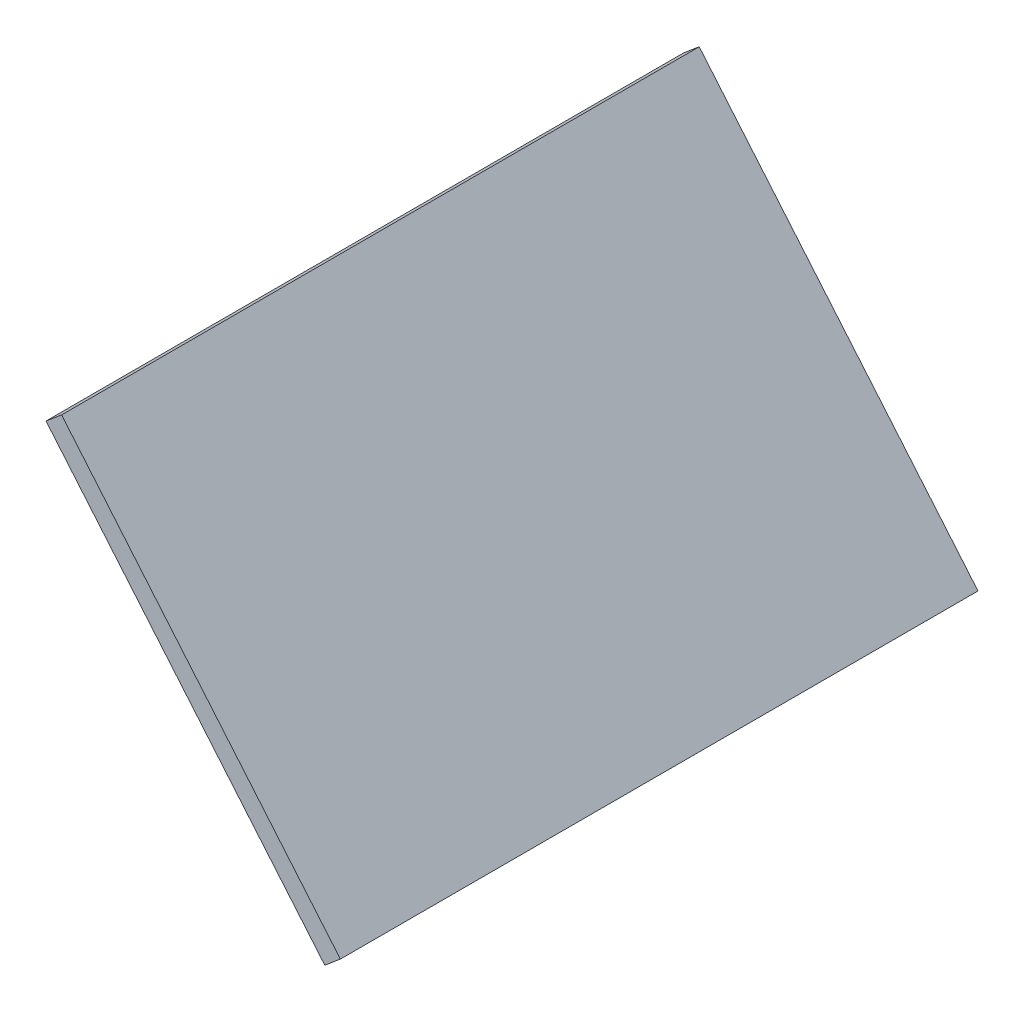
ISO-10303-21;
HEADER;
FILE_DESCRIPTION(('STEP AP214'),'2;1');
FILE_NAME('part.step','',(''),(''),'','','');
FILE_SCHEMA(('AUTOMOTIVE_DESIGN { 1 0 10303 214 1 1 1 1 }'));
ENDSEC;
DATA;
#1=APPLICATION_CONTEXT('core data for automotive mechanical design processes');
#2=APPLICATION_PROTOCOL_DEFINITION('international standard','automotive_design',2000,#1);
#3=PRODUCT_CONTEXT('',#1,'mechanical');
#4=PRODUCT('Part','Part','',(#3));
#5=PRODUCT_RELATED_PRODUCT_CATEGORY('part','',(#4));
#6=PRODUCT_DEFINITION_FORMATION('','',#4);
#7=PRODUCT_DEFINITION_CONTEXT('part definition',#1,'design');
#8=PRODUCT_DEFINITION('design','',#6,#7);
#9=PRODUCT_DEFINITION_SHAPE('','',#8);
#10=(LENGTH_UNIT() NAMED_UNIT(*) SI_UNIT(.MILLI.,.METRE.));
#11=(NAMED_UNIT(*) PLANE_ANGLE_UNIT() SI_UNIT($,.RADIAN.));
#12=(NAMED_UNIT(*) SI_UNIT($,.STERADIAN.) SOLID_ANGLE_UNIT());
#13=UNCERTAINTY_MEASURE_WITH_UNIT(LENGTH_MEASURE(1.E-05),#10,'distance_accuracy_value','');
#14=(GEOMETRIC_REPRESENTATION_CONTEXT(3) GLOBAL_UNCERTAINTY_ASSIGNED_CONTEXT((#13)) GLOBAL_UNIT_ASSIGNED_CONTEXT((#10,
#11,#12)) REPRESENTATION_CONTEXT('',''));
#15=CARTESIAN_POINT('',(0.,0.,0.));
#16=DIRECTION('',(0.,0.,1.));
#17=DIRECTION('',(1.,0.,0.));
#18=AXIS2_PLACEMENT_3D('',#15,#16,#17);
#19=CARTESIAN_POINT('',(-19.177,38.1,38.1));
#20=DIRECTION('',(0.765704864789611,0.643192086423273,0.));
#21=DIRECTION('',(-0.643192086423273,0.765704864789611,0.));
#22=AXIS2_PLACEMENT_3D('',#19,#20,#21);
#23=PLANE('',#22);
#24=DIRECTION('',(0.643192086423273,-0.765704864789611,0.));
#25=VECTOR('',#24,1.);
#26=CARTESIAN_POINT('',(-19.177,38.1,-38.1));
#27=LINE('',#26,#25);
#28=CARTESIAN_POINT('',(-19.177,38.1,-38.1));
#29=VERTEX_POINT('',#28);
#30=CARTESIAN_POINT('',(14.1404849906192,-1.56367260787992,-38.1));
#31=VERTEX_POINT('',#30);
#32=EDGE_CURVE('E67',#29,#31,#27,.T.);
#33=ORIENTED_EDGE('',*,*,#32,.T.);
#34=DIRECTION('',(0.,0.,1.));
#35=VECTOR('',#34,1.);
#36=CARTESIAN_POINT('',(14.1404849906192,-1.56367260787992,-41.6391661482098));
#37=LINE('',#36,#35);
#38=CARTESIAN_POINT('',(14.1404849906192,-1.56367260787992,38.1));
#39=VERTEX_POINT('',#38);
#40=EDGE_CURVE('E123',#31,#39,#37,.T.);
#41=ORIENTED_EDGE('',*,*,#40,.T.);
#42=DIRECTION('',(0.643192086423273,-0.765704864789611,0.));
#43=VECTOR('',#42,1.);
#44=CARTESIAN_POINT('',(-19.177,38.1,38.1));
#45=LINE('',#44,#43);
#46=CARTESIAN_POINT('',(-19.177,38.1,38.1));
#47=VERTEX_POINT('',#46);
#48=EDGE_CURVE('E87',#47,#39,#45,.T.);
#49=ORIENTED_EDGE('',*,*,#48,.F.);
#50=DIRECTION('',(0.,0.,-1.));
#51=VECTOR('',#50,1.);
#52=CARTESIAN_POINT('',(-19.177,38.1,38.1));
#53=LINE('',#52,#51);
#54=EDGE_CURVE('E12',#47,#29,#53,.T.);
#55=ORIENTED_EDGE('',*,*,#54,.T.);
#56=EDGE_LOOP('',(#33,#41,#49,#55));
#57=FACE_BOUND('',#56,.T.);
#58=ADVANCED_FACE('F40',(#57),#23,.F.);
#59=CARTESIAN_POINT('',(-16.002,38.1,38.1));
#60=DIRECTION('',(-0.765704864789611,-0.643192086423273,0.));
#61=DIRECTION('',(0.643192086423273,-0.765704864789611,0.));
#62=AXIS2_PLACEMENT_3D('',#59,#60,#61);
#63=PLANE('',#62);
#64=DIRECTION('',(-0.643192086423273,0.765704864789611,0.));
#65=VECTOR('',#64,1.);
#66=CARTESIAN_POINT('',(-16.002,38.1,-38.1));
#67=LINE('',#66,#65);
#68=CARTESIAN_POINT('',(16.002,0.,-38.1));
#69=VERTEX_POINT('',#68);
#70=CARTESIAN_POINT('',(-17.3154849906191,39.6636726078799,-38.1));
#71=VERTEX_POINT('',#70);
#72=EDGE_CURVE('E93',#69,#71,#67,.T.);
#73=ORIENTED_EDGE('',*,*,#72,.T.);
#74=DIRECTION('',(0.,0.,1.));
#75=VECTOR('',#74,1.);
#76=CARTESIAN_POINT('',(-17.3154849906191,39.6636726078799,-41.6391661482098));
#77=LINE('',#76,#75);
#78=CARTESIAN_POINT('',(-17.3154849906191,39.6636726078799,38.1));
#79=VERTEX_POINT('',#78);
#80=EDGE_CURVE('E90',#71,#79,#77,.T.);
#81=ORIENTED_EDGE('',*,*,#80,.T.);
#82=DIRECTION('',(-0.643192086423273,0.765704864789611,0.));
#83=VECTOR('',#82,1.);
#84=CARTESIAN_POINT('',(-16.002,38.1,38.1));
#85=LINE('',#84,#83);
#86=CARTESIAN_POINT('',(16.002,0.,38.1));
#87=VERTEX_POINT('',#86);
#88=EDGE_CURVE('E55',#87,#79,#85,.T.);
#89=ORIENTED_EDGE('',*,*,#88,.F.);
#90=DIRECTION('',(0.,0.,-1.));
#91=VECTOR('',#90,1.);
#92=CARTESIAN_POINT('',(16.002,0.,38.1));
#93=LINE('',#92,#91);
#94=EDGE_CURVE('E47',#87,#69,#93,.T.);
#95=ORIENTED_EDGE('',*,*,#94,.T.);
#96=EDGE_LOOP('',(#73,#81,#89,#95));
#97=FACE_BOUND('',#96,.T.);
#98=ADVANCED_FACE('F91',(#97),#63,.F.);
#99=CARTESIAN_POINT('',(0.,0.,38.1));
#100=DIRECTION('',(0.,0.,1.));
#101=DIRECTION('',(1.,0.,0.));
#102=AXIS2_PLACEMENT_3D('',#99,#100,#101);
#103=PLANE('',#102);
#104=ORIENTED_EDGE('',*,*,#88,.T.);
#105=DIRECTION('',(-0.765704864789611,-0.643192086423273,0.));
#106=VECTOR('',#105,1.);
#107=CARTESIAN_POINT('',(-17.3154849906191,39.6636726078799,38.1));
#108=LINE('',#107,#106);
#109=EDGE_CURVE('E83',#79,#47,#108,.T.);
#110=ORIENTED_EDGE('',*,*,#109,.T.);
#111=ORIENTED_EDGE('',*,*,#48,.T.);
#112=DIRECTION('',(0.765704864789611,0.643192086423273,0.));
#113=VECTOR('',#112,1.);
#114=CARTESIAN_POINT('',(14.1404849906192,-1.56367260787992,38.1));
#115=LINE('',#114,#113);
#116=EDGE_CURVE('E85',#39,#87,#115,.T.);
#117=ORIENTED_EDGE('',*,*,#116,.T.);
#118=EDGE_LOOP('',(#104,#110,#111,#117));
#119=FACE_BOUND('',#118,.T.);
#120=ADVANCED_FACE('F81',(#119),#103,.T.);
#121=CARTESIAN_POINT('',(0.,0.,-38.1));
#122=DIRECTION('',(0.,0.,1.));
#123=DIRECTION('',(1.,0.,0.));
#124=AXIS2_PLACEMENT_3D('',#121,#122,#123);
#125=PLANE('',#124);
#126=ORIENTED_EDGE('',*,*,#32,.F.);
#127=DIRECTION('',(0.765704864789612,0.643192086423273,0.));
#128=VECTOR('',#127,1.);
#129=CARTESIAN_POINT('',(-17.3154849906191,39.6636726078799,-38.1));
#130=LINE('',#129,#128);
#131=EDGE_CURVE('E97',#29,#71,#130,.T.);
#132=ORIENTED_EDGE('',*,*,#131,.T.);
#133=ORIENTED_EDGE('',*,*,#72,.F.);
#134=DIRECTION('',(-0.765704864789611,-0.643192086423273,0.));
#135=VECTOR('',#134,1.);
#136=CARTESIAN_POINT('',(14.1404849906192,-1.56367260787992,-38.1));
#137=LINE('',#136,#135);
#138=EDGE_CURVE('E105',#69,#31,#137,.T.);
#139=ORIENTED_EDGE('',*,*,#138,.T.);
#140=EDGE_LOOP('',(#126,#132,#133,#139));
#141=FACE_BOUND('',#140,.T.);
#142=ADVANCED_FACE('F120',(#141),#125,.F.);
#143=CARTESIAN_POINT('',(14.1404849906192,-1.56367260787992,-41.6391661482098));
#144=DIRECTION('',(0.643192086423273,-0.765704864789611,0.));
#145=DIRECTION('',(0.765704864789611,0.643192086423273,0.));
#146=AXIS2_PLACEMENT_3D('',#143,#144,#145);
#147=PLANE('',#146);
#148=ORIENTED_EDGE('',*,*,#138,.F.);
#149=ORIENTED_EDGE('',*,*,#94,.F.);
#150=ORIENTED_EDGE('',*,*,#116,.F.);
#151=ORIENTED_EDGE('',*,*,#40,.F.);
#152=EDGE_LOOP('',(#148,#149,#150,#151));
#153=FACE_BOUND('',#152,.T.);
#154=ADVANCED_FACE('F122',(#153),#147,.T.);
#155=CARTESIAN_POINT('',(-17.3154849906191,39.6636726078799,-41.6391661482098));
#156=DIRECTION('',(-0.643192086423273,0.765704864789611,0.));
#157=DIRECTION('',(-0.765704864789612,-0.643192086423273,0.));
#158=AXIS2_PLACEMENT_3D('',#155,#156,#157);
#159=PLANE('',#158);
#160=ORIENTED_EDGE('',*,*,#131,.F.);
#161=ORIENTED_EDGE('',*,*,#54,.F.);
#162=ORIENTED_EDGE('',*,*,#109,.F.);
#163=ORIENTED_EDGE('',*,*,#80,.F.);
#164=EDGE_LOOP('',(#160,#161,#162,#163));
#165=FACE_BOUND('',#164,.T.);
#166=ADVANCED_FACE('F100',(#165),#159,.T.);
#167=CLOSED_SHELL('',(#58,#98,#120,#142,#154,#166));
#168=MANIFOLD_SOLID_BREP('B2',#167);
#169=ADVANCED_BREP_SHAPE_REPRESENTATION('',(#18,#168),#14);
#170=SHAPE_DEFINITION_REPRESENTATION(#9,#169);
ENDSEC;
END-ISO-10303-21;
